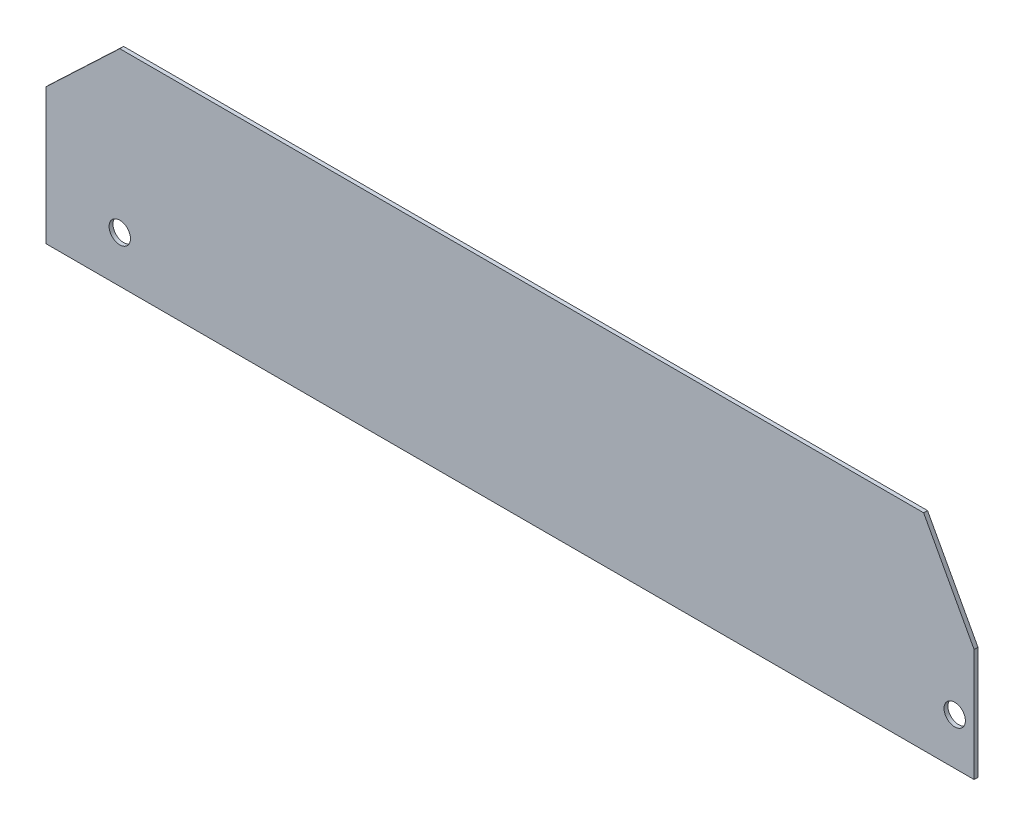
ISO-10303-21;
HEADER;
FILE_DESCRIPTION(('STEP AP214'),'2;1');
FILE_NAME('part.step','',(''),(''),'','','');
FILE_SCHEMA(('AUTOMOTIVE_DESIGN { 1 0 10303 214 1 1 1 1 }'));
ENDSEC;
DATA;
#1=APPLICATION_CONTEXT('core data for automotive mechanical design processes');
#2=APPLICATION_PROTOCOL_DEFINITION('international standard','automotive_design',2000,#1);
#3=PRODUCT_CONTEXT('',#1,'mechanical');
#4=PRODUCT('Part','Part','',(#3));
#5=PRODUCT_RELATED_PRODUCT_CATEGORY('part','',(#4));
#6=PRODUCT_DEFINITION_FORMATION('','',#4);
#7=PRODUCT_DEFINITION_CONTEXT('part definition',#1,'design');
#8=PRODUCT_DEFINITION('design','',#6,#7);
#9=PRODUCT_DEFINITION_SHAPE('','',#8);
#10=(LENGTH_UNIT() NAMED_UNIT(*) SI_UNIT(.MILLI.,.METRE.));
#11=(NAMED_UNIT(*) PLANE_ANGLE_UNIT() SI_UNIT($,.RADIAN.));
#12=(NAMED_UNIT(*) SI_UNIT($,.STERADIAN.) SOLID_ANGLE_UNIT());
#13=UNCERTAINTY_MEASURE_WITH_UNIT(LENGTH_MEASURE(1.E-05),#10,'distance_accuracy_value','');
#14=(GEOMETRIC_REPRESENTATION_CONTEXT(3) GLOBAL_UNCERTAINTY_ASSIGNED_CONTEXT((#13)) GLOBAL_UNIT_ASSIGNED_CONTEXT((#10,
#11,#12)) REPRESENTATION_CONTEXT('',''));
#15=CARTESIAN_POINT('',(0.,0.,0.));
#16=DIRECTION('',(0.,0.,1.));
#17=DIRECTION('',(1.,0.,0.));
#18=AXIS2_PLACEMENT_3D('',#15,#16,#17);
#19=CARTESIAN_POINT('',(0.,0.,1.));
#20=DIRECTION('',(0.,0.,1.));
#21=DIRECTION('',(1.,0.,0.));
#22=AXIS2_PLACEMENT_3D('',#19,#20,#21);
#23=PLANE('',#22);
#24=CARTESIAN_POINT('',(-117.,19.,1.));
#25=DIRECTION('',(0.,0.,1.));
#26=DIRECTION('',(1.,0.,0.));
#27=AXIS2_PLACEMENT_3D('',#24,#25,#26);
#28=CIRCLE('',#27,2.75);
#29=CARTESIAN_POINT('',(-114.25,19.,1.));
#30=VERTEX_POINT('',#29);
#31=EDGE_CURVE('E142',#30,#30,#28,.T.);
#32=ORIENTED_EDGE('',*,*,#31,.F.);
#33=EDGE_LOOP('',(#32));
#34=FACE_BOUND('',#33,.T.);
#35=DIRECTION('',(0.,-1.,0.));
#36=VECTOR('',#35,1.);
#37=CARTESIAN_POINT('',(-136.,42.,1.));
#38=LINE('',#37,#36);
#39=CARTESIAN_POINT('',(-136.,42.,1.));
#40=VERTEX_POINT('',#39);
#41=CARTESIAN_POINT('',(-136.,7.,1.));
#42=VERTEX_POINT('',#41);
#43=EDGE_CURVE('E153',#40,#42,#38,.T.);
#44=ORIENTED_EDGE('',*,*,#43,.T.);
#45=DIRECTION('',(1.,0.,0.));
#46=VECTOR('',#45,1.);
#47=CARTESIAN_POINT('',(-136.,7.,1.));
#48=LINE('',#47,#46);
#49=CARTESIAN_POINT('',(103.,7.,1.));
#50=VERTEX_POINT('',#49);
#51=EDGE_CURVE('E100',#42,#50,#48,.T.);
#52=ORIENTED_EDGE('',*,*,#51,.T.);
#53=DIRECTION('',(0.,1.,0.));
#54=VECTOR('',#53,1.);
#55=CARTESIAN_POINT('',(103.,7.,1.));
#56=LINE('',#55,#54);
#57=CARTESIAN_POINT('',(103.,36.,1.));
#58=VERTEX_POINT('',#57);
#59=EDGE_CURVE('E113',#50,#58,#56,.T.);
#60=ORIENTED_EDGE('',*,*,#59,.T.);
#61=DIRECTION('',(-0.476283148540753,0.879291966536774,0.));
#62=VECTOR('',#61,1.);
#63=CARTESIAN_POINT('',(103.,36.,1.));
#64=LINE('',#63,#62);
#65=CARTESIAN_POINT('',(90.,60.,1.));
#66=VERTEX_POINT('',#65);
#67=EDGE_CURVE('E107',#58,#66,#64,.T.);
#68=ORIENTED_EDGE('',*,*,#67,.T.);
#69=DIRECTION('',(-1.,0.,0.));
#70=VECTOR('',#69,1.);
#71=CARTESIAN_POINT('',(90.,60.,1.));
#72=LINE('',#71,#70);
#73=CARTESIAN_POINT('',(-117.,60.,1.));
#74=VERTEX_POINT('',#73);
#75=EDGE_CURVE('E111',#66,#74,#72,.T.);
#76=ORIENTED_EDGE('',*,*,#75,.T.);
#77=DIRECTION('',(-0.725952683905827,-0.687744647910783,0.));
#78=VECTOR('',#77,1.);
#79=CARTESIAN_POINT('',(-117.,60.,1.));
#80=LINE('',#79,#78);
#81=EDGE_CURVE('E63',#74,#40,#80,.T.);
#82=ORIENTED_EDGE('',*,*,#81,.T.);
#83=EDGE_LOOP('',(#44,#52,#60,#68,#76,#82));
#84=FACE_BOUND('',#83,.T.);
#85=CARTESIAN_POINT('',(98.,19.,1.));
#86=DIRECTION('',(0.,0.,1.));
#87=DIRECTION('',(1.,0.,0.));
#88=AXIS2_PLACEMENT_3D('',#85,#86,#87);
#89=CIRCLE('',#88,2.75);
#90=CARTESIAN_POINT('',(100.75,19.,1.));
#91=VERTEX_POINT('',#90);
#92=EDGE_CURVE('E195',#91,#91,#89,.T.);
#93=ORIENTED_EDGE('',*,*,#92,.F.);
#94=EDGE_LOOP('',(#93));
#95=FACE_BOUND('',#94,.T.);
#96=ADVANCED_FACE('F45',(#34,#84,#95),#23,.T.);
#97=CARTESIAN_POINT('',(0.,0.,0.));
#98=DIRECTION('',(0.,0.,1.));
#99=DIRECTION('',(1.,0.,0.));
#100=AXIS2_PLACEMENT_3D('',#97,#98,#99);
#101=PLANE('',#100);
#102=DIRECTION('',(0.,-1.,0.));
#103=VECTOR('',#102,1.);
#104=CARTESIAN_POINT('',(-136.,42.,0.));
#105=LINE('',#104,#103);
#106=CARTESIAN_POINT('',(-136.,42.,0.));
#107=VERTEX_POINT('',#106);
#108=CARTESIAN_POINT('',(-136.,7.,0.));
#109=VERTEX_POINT('',#108);
#110=EDGE_CURVE('E137',#107,#109,#105,.T.);
#111=ORIENTED_EDGE('',*,*,#110,.F.);
#112=DIRECTION('',(-0.725952683905827,-0.687744647910783,0.));
#113=VECTOR('',#112,1.);
#114=CARTESIAN_POINT('',(-117.,60.,0.));
#115=LINE('',#114,#113);
#116=CARTESIAN_POINT('',(-117.,60.,0.));
#117=VERTEX_POINT('',#116);
#118=EDGE_CURVE('E92',#117,#107,#115,.T.);
#119=ORIENTED_EDGE('',*,*,#118,.F.);
#120=DIRECTION('',(-1.,0.,0.));
#121=VECTOR('',#120,1.);
#122=CARTESIAN_POINT('',(90.,60.,0.));
#123=LINE('',#122,#121);
#124=CARTESIAN_POINT('',(90.,60.,0.));
#125=VERTEX_POINT('',#124);
#126=EDGE_CURVE('E86',#125,#117,#123,.T.);
#127=ORIENTED_EDGE('',*,*,#126,.F.);
#128=DIRECTION('',(-0.476283148540753,0.879291966536774,0.));
#129=VECTOR('',#128,1.);
#130=CARTESIAN_POINT('',(103.,36.,0.));
#131=LINE('',#130,#129);
#132=CARTESIAN_POINT('',(103.,36.,0.));
#133=VERTEX_POINT('',#132);
#134=EDGE_CURVE('E122',#133,#125,#131,.T.);
#135=ORIENTED_EDGE('',*,*,#134,.F.);
#136=DIRECTION('',(0.,1.,0.));
#137=VECTOR('',#136,1.);
#138=CARTESIAN_POINT('',(103.,7.,0.));
#139=LINE('',#138,#137);
#140=CARTESIAN_POINT('',(103.,7.,0.));
#141=VERTEX_POINT('',#140);
#142=EDGE_CURVE('E145',#141,#133,#139,.T.);
#143=ORIENTED_EDGE('',*,*,#142,.F.);
#144=DIRECTION('',(1.,0.,0.));
#145=VECTOR('',#144,1.);
#146=CARTESIAN_POINT('',(-136.,7.,0.));
#147=LINE('',#146,#145);
#148=EDGE_CURVE('E141',#109,#141,#147,.T.);
#149=ORIENTED_EDGE('',*,*,#148,.F.);
#150=EDGE_LOOP('',(#111,#119,#127,#135,#143,#149));
#151=FACE_BOUND('',#150,.T.);
#152=CARTESIAN_POINT('',(-117.,19.,0.));
#153=DIRECTION('',(0.,0.,1.));
#154=DIRECTION('',(1.,0.,0.));
#155=AXIS2_PLACEMENT_3D('',#152,#153,#154);
#156=CIRCLE('',#155,2.75);
#157=CARTESIAN_POINT('',(-114.25,19.,0.));
#158=VERTEX_POINT('',#157);
#159=EDGE_CURVE('E205',#158,#158,#156,.T.);
#160=ORIENTED_EDGE('',*,*,#159,.T.);
#161=EDGE_LOOP('',(#160));
#162=FACE_BOUND('',#161,.T.);
#163=CARTESIAN_POINT('',(98.,19.,0.));
#164=DIRECTION('',(0.,0.,1.));
#165=DIRECTION('',(1.,0.,0.));
#166=AXIS2_PLACEMENT_3D('',#163,#164,#165);
#167=CIRCLE('',#166,2.75);
#168=CARTESIAN_POINT('',(100.75,19.,0.));
#169=VERTEX_POINT('',#168);
#170=EDGE_CURVE('E198',#169,#169,#167,.T.);
#171=ORIENTED_EDGE('',*,*,#170,.T.);
#172=EDGE_LOOP('',(#171));
#173=FACE_BOUND('',#172,.T.);
#174=ADVANCED_FACE('F165',(#151,#162,#173),#101,.F.);
#175=CARTESIAN_POINT('',(-136.,42.,1.));
#176=DIRECTION('',(1.,0.,0.));
#177=DIRECTION('',(0.,0.,-1.));
#178=AXIS2_PLACEMENT_3D('',#175,#176,#177);
#179=PLANE('',#178);
#180=ORIENTED_EDGE('',*,*,#110,.T.);
#181=DIRECTION('',(0.,0.,-1.));
#182=VECTOR('',#181,1.);
#183=CARTESIAN_POINT('',(-136.,7.,1.));
#184=LINE('',#183,#182);
#185=EDGE_CURVE('E11',#42,#109,#184,.T.);
#186=ORIENTED_EDGE('',*,*,#185,.F.);
#187=ORIENTED_EDGE('',*,*,#43,.F.);
#188=DIRECTION('',(0.,0.,-1.));
#189=VECTOR('',#188,1.);
#190=CARTESIAN_POINT('',(-136.,42.,1.));
#191=LINE('',#190,#189);
#192=EDGE_CURVE('E133',#40,#107,#191,.T.);
#193=ORIENTED_EDGE('',*,*,#192,.T.);
#194=EDGE_LOOP('',(#180,#186,#187,#193));
#195=FACE_BOUND('',#194,.T.);
#196=ADVANCED_FACE('F47',(#195),#179,.F.);
#197=CARTESIAN_POINT('',(-136.,7.,1.));
#198=DIRECTION('',(0.,1.,0.));
#199=DIRECTION('',(0.,0.,1.));
#200=AXIS2_PLACEMENT_3D('',#197,#198,#199);
#201=PLANE('',#200);
#202=ORIENTED_EDGE('',*,*,#148,.T.);
#203=DIRECTION('',(0.,0.,-1.));
#204=VECTOR('',#203,1.);
#205=CARTESIAN_POINT('',(103.,7.,1.));
#206=LINE('',#205,#204);
#207=EDGE_CURVE('E55',#50,#141,#206,.T.);
#208=ORIENTED_EDGE('',*,*,#207,.F.);
#209=ORIENTED_EDGE('',*,*,#51,.F.);
#210=ORIENTED_EDGE('',*,*,#185,.T.);
#211=EDGE_LOOP('',(#202,#208,#209,#210));
#212=FACE_BOUND('',#211,.T.);
#213=ADVANCED_FACE('F250',(#212),#201,.F.);
#214=CARTESIAN_POINT('',(103.,7.,1.));
#215=DIRECTION('',(-1.,0.,0.));
#216=DIRECTION('',(0.,0.,1.));
#217=AXIS2_PLACEMENT_3D('',#214,#215,#216);
#218=PLANE('',#217);
#219=ORIENTED_EDGE('',*,*,#142,.T.);
#220=DIRECTION('',(0.,0.,-1.));
#221=VECTOR('',#220,1.);
#222=CARTESIAN_POINT('',(103.,36.,1.));
#223=LINE('',#222,#221);
#224=EDGE_CURVE('E124',#58,#133,#223,.T.);
#225=ORIENTED_EDGE('',*,*,#224,.F.);
#226=ORIENTED_EDGE('',*,*,#59,.F.);
#227=ORIENTED_EDGE('',*,*,#207,.T.);
#228=EDGE_LOOP('',(#219,#225,#226,#227));
#229=FACE_BOUND('',#228,.T.);
#230=ADVANCED_FACE('F162',(#229),#218,.F.);
#231=CARTESIAN_POINT('',(103.,36.,1.));
#232=DIRECTION('',(-0.879291966536774,-0.476283148540753,0.));
#233=DIRECTION('',(0.476283148540753,-0.879291966536774,0.));
#234=AXIS2_PLACEMENT_3D('',#231,#232,#233);
#235=PLANE('',#234);
#236=ORIENTED_EDGE('',*,*,#134,.T.);
#237=DIRECTION('',(0.,0.,-1.));
#238=VECTOR('',#237,1.);
#239=CARTESIAN_POINT('',(90.,60.,1.));
#240=LINE('',#239,#238);
#241=EDGE_CURVE('E119',#66,#125,#240,.T.);
#242=ORIENTED_EDGE('',*,*,#241,.F.);
#243=ORIENTED_EDGE('',*,*,#67,.F.);
#244=ORIENTED_EDGE('',*,*,#224,.T.);
#245=EDGE_LOOP('',(#236,#242,#243,#244));
#246=FACE_BOUND('',#245,.T.);
#247=ADVANCED_FACE('F120',(#246),#235,.F.);
#248=CARTESIAN_POINT('',(90.,60.,1.));
#249=DIRECTION('',(0.,-1.,0.));
#250=DIRECTION('',(0.,0.,-1.));
#251=AXIS2_PLACEMENT_3D('',#248,#249,#250);
#252=PLANE('',#251);
#253=ORIENTED_EDGE('',*,*,#126,.T.);
#254=DIRECTION('',(0.,0.,-1.));
#255=VECTOR('',#254,1.);
#256=CARTESIAN_POINT('',(-117.,60.,1.));
#257=LINE('',#256,#255);
#258=EDGE_CURVE('E125',#74,#117,#257,.T.);
#259=ORIENTED_EDGE('',*,*,#258,.F.);
#260=ORIENTED_EDGE('',*,*,#75,.F.);
#261=ORIENTED_EDGE('',*,*,#241,.T.);
#262=EDGE_LOOP('',(#253,#259,#260,#261));
#263=FACE_BOUND('',#262,.T.);
#264=ADVANCED_FACE('F127',(#263),#252,.F.);
#265=CARTESIAN_POINT('',(-117.,60.,1.));
#266=DIRECTION('',(0.687744647910783,-0.725952683905827,0.));
#267=DIRECTION('',(0.725952683905827,0.687744647910783,0.));
#268=AXIS2_PLACEMENT_3D('',#265,#266,#267);
#269=PLANE('',#268);
#270=ORIENTED_EDGE('',*,*,#118,.T.);
#271=ORIENTED_EDGE('',*,*,#192,.F.);
#272=ORIENTED_EDGE('',*,*,#81,.F.);
#273=ORIENTED_EDGE('',*,*,#258,.T.);
#274=EDGE_LOOP('',(#270,#271,#272,#273));
#275=FACE_BOUND('',#274,.T.);
#276=ADVANCED_FACE('F170',(#275),#269,.F.);
#277=CARTESIAN_POINT('',(-117.,19.,1.));
#278=DIRECTION('',(0.,0.,-1.));
#279=DIRECTION('',(-1.,0.,0.));
#280=AXIS2_PLACEMENT_3D('',#277,#278,#279);
#281=CYLINDRICAL_SURFACE('',#280,2.75);
#282=ORIENTED_EDGE('',*,*,#31,.T.);
#283=EDGE_LOOP('',(#282));
#284=FACE_BOUND('',#283,.T.);
#285=ORIENTED_EDGE('',*,*,#159,.F.);
#286=EDGE_LOOP('',(#285));
#287=FACE_BOUND('',#286,.T.);
#288=ADVANCED_FACE('F172',(#284,#287),#281,.F.);
#289=CARTESIAN_POINT('',(98.,19.,1.));
#290=DIRECTION('',(0.,0.,-1.));
#291=DIRECTION('',(-1.,0.,0.));
#292=AXIS2_PLACEMENT_3D('',#289,#290,#291);
#293=CYLINDRICAL_SURFACE('',#292,2.75);
#294=ORIENTED_EDGE('',*,*,#92,.T.);
#295=EDGE_LOOP('',(#294));
#296=FACE_BOUND('',#295,.T.);
#297=ORIENTED_EDGE('',*,*,#170,.F.);
#298=EDGE_LOOP('',(#297));
#299=FACE_BOUND('',#298,.T.);
#300=ADVANCED_FACE('F177',(#296,#299),#293,.F.);
#301=CLOSED_SHELL('',(#96,#174,#196,#213,#230,#247,#264,#276,#288,#300));
#302=MANIFOLD_SOLID_BREP('B2',#301);
#303=ADVANCED_BREP_SHAPE_REPRESENTATION('',(#18,#302),#14);
#304=SHAPE_DEFINITION_REPRESENTATION(#9,#303);
ENDSEC;
END-ISO-10303-21;
